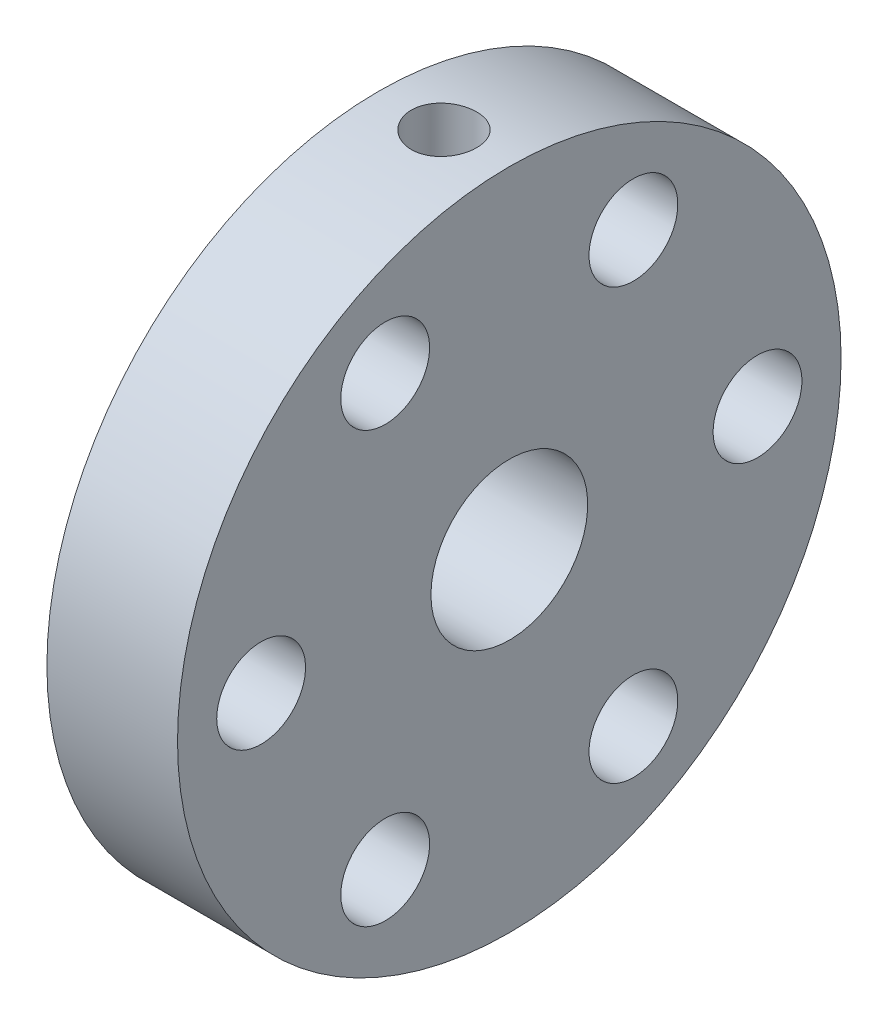
ISO-10303-21;
HEADER;
FILE_DESCRIPTION(('STEP AP214'),'2;1');
FILE_NAME('part.step','',(''),(''),'','','');
FILE_SCHEMA(('AUTOMOTIVE_DESIGN { 1 0 10303 214 1 1 1 1 }'));
ENDSEC;
DATA;
#1=APPLICATION_CONTEXT('core data for automotive mechanical design processes');
#2=APPLICATION_PROTOCOL_DEFINITION('international standard','automotive_design',2000,#1);
#3=PRODUCT_CONTEXT('',#1,'mechanical');
#4=PRODUCT('Part','Part','',(#3));
#5=PRODUCT_RELATED_PRODUCT_CATEGORY('part','',(#4));
#6=PRODUCT_DEFINITION_FORMATION('','',#4);
#7=PRODUCT_DEFINITION_CONTEXT('part definition',#1,'design');
#8=PRODUCT_DEFINITION('design','',#6,#7);
#9=PRODUCT_DEFINITION_SHAPE('','',#8);
#10=(LENGTH_UNIT() NAMED_UNIT(*) SI_UNIT(.MILLI.,.METRE.));
#11=(NAMED_UNIT(*) PLANE_ANGLE_UNIT() SI_UNIT($,.RADIAN.));
#12=(NAMED_UNIT(*) SI_UNIT($,.STERADIAN.) SOLID_ANGLE_UNIT());
#13=UNCERTAINTY_MEASURE_WITH_UNIT(LENGTH_MEASURE(1.E-05),#10,'distance_accuracy_value','');
#14=(GEOMETRIC_REPRESENTATION_CONTEXT(3) GLOBAL_UNCERTAINTY_ASSIGNED_CONTEXT((#13)) GLOBAL_UNIT_ASSIGNED_CONTEXT((#10,
#11,#12)) REPRESENTATION_CONTEXT('',''));
#15=CARTESIAN_POINT('',(0.,0.,0.));
#16=DIRECTION('',(0.,0.,1.));
#17=DIRECTION('',(1.,0.,0.));
#18=AXIS2_PLACEMENT_3D('',#15,#16,#17);
#19=CARTESIAN_POINT('',(-4.2,0.,0.));
#20=DIRECTION('',(-1.,0.,0.));
#21=DIRECTION('',(0.,0.,1.));
#22=AXIS2_PLACEMENT_3D('',#19,#20,#21);
#23=PLANE('',#22);
#24=CARTESIAN_POINT('',(-4.2,0.,0.));
#25=DIRECTION('',(-1.,0.,0.));
#26=DIRECTION('',(0.,0.,1.));
#27=AXIS2_PLACEMENT_3D('',#24,#25,#26);
#28=CIRCLE('',#27,6.);
#29=CARTESIAN_POINT('',(-4.2,0.,6.));
#30=VERTEX_POINT('',#29);
#31=EDGE_CURVE('E115',#30,#30,#28,.T.);
#32=ORIENTED_EDGE('',*,*,#31,.T.);
#33=EDGE_LOOP('',(#32));
#34=FACE_BOUND('',#33,.T.);
#35=CARTESIAN_POINT('',(-4.2,0.,0.));
#36=DIRECTION('',(-1.,0.,0.));
#37=DIRECTION('',(0.,0.,1.));
#38=AXIS2_PLACEMENT_3D('',#35,#36,#37);
#39=CIRCLE('',#38,3.);
#40=CARTESIAN_POINT('',(-4.2,0.,3.));
#41=VERTEX_POINT('',#40);
#42=EDGE_CURVE('E41',#41,#41,#39,.T.);
#43=ORIENTED_EDGE('',*,*,#42,.F.);
#44=EDGE_LOOP('',(#43));
#45=FACE_BOUND('',#44,.T.);
#46=ADVANCED_FACE('F31',(#34,#45),#23,.T.);
#47=CARTESIAN_POINT('',(0.,0.,0.));
#48=DIRECTION('',(-1.,0.,0.));
#49=DIRECTION('',(0.,0.,1.));
#50=AXIS2_PLACEMENT_3D('',#47,#48,#49);
#51=CYLINDRICAL_SURFACE('',#50,3.);
#52=CARTESIAN_POINT('',(2.5,2.72717802865893,-1.25));
#53=CARTESIAN_POINT('',(2.56667189089685,2.72718519563219,-1.24999259066567));
#54=CARTESIAN_POINT('',(2.63345265682622,2.729658595344,-1.24463203881503));
#55=CARTESIAN_POINT('',(2.76508694205714,2.73923833650884,-1.22339678947784));
#56=CARTESIAN_POINT('',(2.82993472667524,2.74635725824267,-1.20749354003276));
#57=CARTESIAN_POINT('',(2.95556112969107,2.76426917574768,-1.1658998841945));
#58=CARTESIAN_POINT('',(3.01635516371502,2.77504717562616,-1.14024937431428));
#59=CARTESIAN_POINT('',(3.13275944957805,2.79904148565793,-1.08000637754462));
#60=CARTESIAN_POINT('',(3.18837092343312,2.81225721880783,-1.04541600591531));
#61=CARTESIAN_POINT('',(3.29632572497347,2.84055762619857,-0.965973882676165));
#62=CARTESIAN_POINT('',(3.34830755874409,2.85570568079146,-0.920653238184407));
#63=CARTESIAN_POINT('',(3.44420022249755,2.88564295372227,-0.822021675745548));
#64=CARTESIAN_POINT('',(3.48810794061301,2.90043203180789,-0.768707691374003));
#65=CARTESIAN_POINT('',(3.56844953087928,2.92875537930613,-0.652763393797347));
#66=CARTESIAN_POINT('',(3.60447662803235,2.94220739975291,-0.589829293683658));
#67=CARTESIAN_POINT('',(3.6652760205056,2.96556519993426,-0.458132022362352));
#68=CARTESIAN_POINT('',(3.69005331196422,2.97547255347157,-0.389371454872124));
#69=CARTESIAN_POINT('',(3.72633945875674,2.99017521042367,-0.251768498025165));
#70=CARTESIAN_POINT('',(3.73847169490204,2.99520971127466,-0.18311657619608));
#71=CARTESIAN_POINT('',(3.75113764115986,3.00046828611204,-0.044579180365006));
#72=CARTESIAN_POINT('',(3.75167605588296,3.00069431131015,0.0253057817645163));
#73=CARTESIAN_POINT('',(3.74146571906668,2.99645129133057,0.159792780112568));
#74=CARTESIAN_POINT('',(3.73140189947427,2.99226714648664,0.224457488607313));
#75=CARTESIAN_POINT('',(3.70144689736184,2.98006516750309,0.351082893931455));
#76=CARTESIAN_POINT('',(3.68155499036983,2.97204705074577,0.413043391054915));
#77=CARTESIAN_POINT('',(3.63227195910536,2.95279852414029,0.533638118077525));
#78=CARTESIAN_POINT('',(3.60274053712917,2.94152097126085,0.592207177074905));
#79=CARTESIAN_POINT('',(3.53515424329966,2.91685713989805,0.703711767281962));
#80=CARTESIAN_POINT('',(3.49709635915501,2.90347011666255,0.756645297756973));
#81=CARTESIAN_POINT('',(3.41041757959538,2.87481698777061,0.859340911707923));
#82=CARTESIAN_POINT('',(3.36124120872099,2.8594849435601,0.908616437316239));
#83=CARTESIAN_POINT('',(3.25528855929342,2.8293786068147,0.998431414927666));
#84=CARTESIAN_POINT('',(3.19850936170791,2.8146045313137,1.03896749582431));
#85=CARTESIAN_POINT('',(3.07660496333809,2.78681612355338,1.11140189250063));
#86=CARTESIAN_POINT('',(3.01126679425672,2.77387558556714,1.1429725335554));
#87=CARTESIAN_POINT('',(2.8755189550255,2.75209844221011,1.19446432058391));
#88=CARTESIAN_POINT('',(2.80511295173045,2.74325890334594,1.21439379627313));
#89=CARTESIAN_POINT('',(2.666103191086,2.73141212519724,1.24080025168121));
#90=CARTESIAN_POINT('',(2.59767887774095,2.72806369197117,1.24806614632866));
#91=CARTESIAN_POINT('',(2.4605215175885,2.72660286810642,1.25125630518998));
#92=CARTESIAN_POINT('',(2.39178858580829,2.72848866599319,1.24718449318149));
#93=CARTESIAN_POINT('',(2.26060161456955,2.73693131345749,1.22853477565556));
#94=CARTESIAN_POINT('',(2.1980273132132,2.74318138016618,1.21464618818048));
#95=CARTESIAN_POINT('',(2.07614870350213,2.75925630297447,1.17767058564225));
#96=CARTESIAN_POINT('',(2.01684516316929,2.76908199460161,1.15458142053125));
#97=CARTESIAN_POINT('',(1.90038468964353,2.79170797857,1.09877520805186));
#98=CARTESIAN_POINT('',(1.84342502538968,2.80461662202282,1.06569183306198));
#99=CARTESIAN_POINT('',(1.73559194750098,2.83180003740794,0.991200784385969));
#100=CARTESIAN_POINT('',(1.68472118329813,2.84607539920583,0.949789507875986));
#101=CARTESIAN_POINT('',(1.586199865116,2.87578619784532,0.855844455715504));
#102=CARTESIAN_POINT('',(1.53914860004934,2.89122146708842,0.802679661479737));
#103=CARTESIAN_POINT('',(1.45452770802067,2.92043361183923,0.688851512553538));
#104=CARTESIAN_POINT('',(1.4169587759363,2.93421036577013,0.628187608803656));
#105=CARTESIAN_POINT('',(1.35241012455643,2.9586425158565,0.500654680803384));
#106=CARTESIAN_POINT('',(1.32545775871052,2.96928983138826,0.433770169638506));
#107=CARTESIAN_POINT('',(1.28338320766557,2.98618173103366,0.295858835154416));
#108=CARTESIAN_POINT('',(1.26825398177393,2.9924289351992,0.224834504225195));
#109=CARTESIAN_POINT('',(1.25114187447969,2.9995153479751,0.0860165335064112));
#110=CARTESIAN_POINT('',(1.24831400030304,3.00070204534225,0.018344084793898));
#111=CARTESIAN_POINT('',(1.25361314129394,2.99849523480953,-0.116486811714285));
#112=CARTESIAN_POINT('',(1.26173823601287,2.99510252984313,-0.183645347541155));
#113=CARTESIAN_POINT('',(1.28810607215866,2.98430065981734,-0.313086482449184));
#114=CARTESIAN_POINT('',(1.30597968046955,2.97703824209233,-0.375457537843568));
#115=CARTESIAN_POINT('',(1.35093424720913,2.95929499847058,-0.49629223050133));
#116=CARTESIAN_POINT('',(1.37801695466491,2.94881356124207,-0.554755122985826));
#117=CARTESIAN_POINT('',(1.44198952921447,2.92505825398662,-0.669024565478781));
#118=CARTESIAN_POINT('',(1.47926730142399,2.91167959188766,-0.724591657976681));
#119=CARTESIAN_POINT('',(1.56200718287189,2.88371561874231,-0.828918675638781));
#120=CARTESIAN_POINT('',(1.60747233040675,2.86912986083797,-0.877676061786041));
#121=CARTESIAN_POINT('',(1.70894482585441,2.83914845259141,-0.970449787231579));
#122=CARTESIAN_POINT('',(1.76545901462112,2.82376522857896,-1.01391775364847));
#123=CARTESIAN_POINT('',(1.8854587406802,2.79495552690186,-1.09083332306674));
#124=CARTESIAN_POINT('',(1.94894814805814,2.78153014522558,-1.12427532456755));
#125=CARTESIAN_POINT('',(2.08094383502275,2.75842557732642,-1.17982766043577));
#126=CARTESIAN_POINT('',(2.14942115879321,2.74872654469865,-1.20199823632853));
#127=CARTESIAN_POINT('',(2.28953957385067,2.73440803066667,-1.23423556453801));
#128=CARTESIAN_POINT('',(2.3611692072743,2.72977151604981,-1.2443429152121));
#129=CARTESIAN_POINT('',(2.45535852426189,2.72744979732688,-1.24940464923649));
#130=CARTESIAN_POINT('',(2.47767315738804,2.72717562860874,-1.25000248121118));
#131=CARTESIAN_POINT('',(2.5,2.72717802865893,-1.25));
#132=B_SPLINE_CURVE_WITH_KNOTS('',3,(#52,#53,#54,#55,#56,#57,#58,#59,#60,#61,#62,#63,#64,#65,
#66,#67,#68,#69,#70,#71,#72,#73,#74,#75,#76,#77,#78,#79,#80,#81,#82,#83,#84,#85,#86,#87,#88,#89,
#90,#91,#92,#93,#94,#95,#96,#97,#98,#99,#100,#101,#102,#103,#104,#105,#106,#107,#108,#109,#110,
#111,#112,#113,#114,#115,#116,#117,#118,#119,#120,#121,#122,#123,#124,#125,#126,#127,#128,#129,
#130,#131),.UNSPECIFIED.,.T.,.F.,(4,2,2,2,2,2,2,2,2,2,2,2,2,2,2,2,2,2,2,2,2,2,2,2,2,2,2,2,2,2,2,
2,2,2,2,2,2,2,2,4),(0.,0.199951711985515,0.400447161842175,0.60013065215211,0.799766938550098,
1.01066841430654,1.2216510045991,1.44178476577924,1.66182066774891,1.87040605977952,
2.0789068091793,2.27471840245092,2.47054443201883,2.66935814640065,2.86824221022483,
3.08114531844484,3.29413040441366,3.51411545666721,3.73394290745568,3.93950778306307,
4.14500152518448,4.33733901066191,4.52972146913529,4.73025126818168,4.93086800795465,
5.14781662735513,5.36478114041865,5.58230105955594,5.79969134643007,6.00188635094053,
6.20404590801913,6.39903415036487,6.59405944632172,6.79789862829036,7.00181361048903,
7.21960426908076,7.43751638139188,7.65425125796864,7.87025464546161,7.93721375436705),.UNSPECIFIED.);
#133=CARTESIAN_POINT('',(2.5,2.72717802865893,-1.25));
#134=VERTEX_POINT('',#133);
#135=EDGE_CURVE('E59',#134,#134,#132,.T.);
#136=ORIENTED_EDGE('',*,*,#135,.F.);
#137=EDGE_LOOP('',(#136));
#138=FACE_BOUND('',#137,.T.);
#139=CARTESIAN_POINT('',(-2.1,2.72717802865893,-1.25));
#140=CARTESIAN_POINT('',(-2.03332810910315,2.72718519563219,-1.24999259066567));
#141=CARTESIAN_POINT('',(-1.96654734317379,2.729658595344,-1.24463203881503));
#142=CARTESIAN_POINT('',(-1.83491305794286,2.73923833650884,-1.22339678947784));
#143=CARTESIAN_POINT('',(-1.77006527332477,2.74635725824267,-1.20749354003276));
#144=CARTESIAN_POINT('',(-1.64443887030893,2.76426917574768,-1.1658998841945));
#145=CARTESIAN_POINT('',(-1.58364483628498,2.77504717562616,-1.14024937431428));
#146=CARTESIAN_POINT('',(-1.46724055042195,2.79904148565793,-1.08000637754462));
#147=CARTESIAN_POINT('',(-1.41162907656688,2.81225721880783,-1.04541600591531));
#148=CARTESIAN_POINT('',(-1.30367427502653,2.84055762619857,-0.965973882676165));
#149=CARTESIAN_POINT('',(-1.25169244125591,2.85570568079146,-0.920653238184407));
#150=CARTESIAN_POINT('',(-1.15579977750245,2.88564295372227,-0.822021675745549));
#151=CARTESIAN_POINT('',(-1.11189205938699,2.90043203180789,-0.768707691374003));
#152=CARTESIAN_POINT('',(-1.03155046912072,2.92875537930613,-0.652763393797347));
#153=CARTESIAN_POINT('',(-0.995523371967654,2.94220739975291,-0.589829293683658));
#154=CARTESIAN_POINT('',(-0.934723979494398,2.96556519993426,-0.458132022362352));
#155=CARTESIAN_POINT('',(-0.909946688035785,2.97547255347157,-0.389371454872124));
#156=CARTESIAN_POINT('',(-0.873660541243262,2.99017521042367,-0.251768498025165));
#157=CARTESIAN_POINT('',(-0.861528305097957,2.99520971127466,-0.18311657619608));
#158=CARTESIAN_POINT('',(-0.848862358840145,3.00046828611204,-0.0445791803650059));
#159=CARTESIAN_POINT('',(-0.848323944117042,3.00069431131015,0.0253057817645164));
#160=CARTESIAN_POINT('',(-0.858534280933322,2.99645129133057,0.159792780112568));
#161=CARTESIAN_POINT('',(-0.86859810052573,2.99226714648664,0.224457488607313));
#162=CARTESIAN_POINT('',(-0.898553102638165,2.98006516750309,0.351082893931455));
#163=CARTESIAN_POINT('',(-0.918445009630167,2.97204705074577,0.413043391054915));
#164=CARTESIAN_POINT('',(-0.967728040894644,2.95279852414029,0.533638118077525));
#165=CARTESIAN_POINT('',(-0.997259462870826,2.94152097126085,0.592207177074905));
#166=CARTESIAN_POINT('',(-1.06484575670034,2.91685713989805,0.703711767281962));
#167=CARTESIAN_POINT('',(-1.10290364084499,2.90347011666255,0.756645297756973));
#168=CARTESIAN_POINT('',(-1.18958242040462,2.87481698777061,0.859340911707922));
#169=CARTESIAN_POINT('',(-1.23875879127901,2.8594849435601,0.908616437316239));
#170=CARTESIAN_POINT('',(-1.34471144070658,2.8293786068147,0.998431414927666));
#171=CARTESIAN_POINT('',(-1.40149063829209,2.8146045313137,1.03896749582431));
#172=CARTESIAN_POINT('',(-1.52339503666191,2.78681612355338,1.11140189250063));
#173=CARTESIAN_POINT('',(-1.58873320574328,2.77387558556714,1.1429725335554));
#174=CARTESIAN_POINT('',(-1.7244810449745,2.75209844221011,1.19446432058391));
#175=CARTESIAN_POINT('',(-1.79488704826955,2.74325890334594,1.21439379627313));
#176=CARTESIAN_POINT('',(-1.933896808914,2.73141212519724,1.24080025168121));
#177=CARTESIAN_POINT('',(-2.00232112225905,2.72806369197117,1.24806614632866));
#178=CARTESIAN_POINT('',(-2.1394784824115,2.72660286810642,1.25125630518998));
#179=CARTESIAN_POINT('',(-2.20821141419171,2.72848866599319,1.24718449318149));
#180=CARTESIAN_POINT('',(-2.33939838543045,2.73693131345749,1.22853477565556));
#181=CARTESIAN_POINT('',(-2.4019726867868,2.74318138016618,1.21464618818048));
#182=CARTESIAN_POINT('',(-2.52385129649787,2.75925630297447,1.17767058564225));
#183=CARTESIAN_POINT('',(-2.58315483683071,2.76908199460161,1.15458142053125));
#184=CARTESIAN_POINT('',(-2.69961531035647,2.79170797857,1.09877520805186));
#185=CARTESIAN_POINT('',(-2.75657497461032,2.80461662202282,1.06569183306198));
#186=CARTESIAN_POINT('',(-2.86440805249902,2.83180003740794,0.991200784385969));
#187=CARTESIAN_POINT('',(-2.91527881670187,2.84607539920583,0.949789507875986));
#188=CARTESIAN_POINT('',(-3.013800134884,2.87578619784532,0.855844455715504));
#189=CARTESIAN_POINT('',(-3.06085139995066,2.89122146708842,0.802679661479737));
#190=CARTESIAN_POINT('',(-3.14547229197933,2.92043361183923,0.688851512553538));
#191=CARTESIAN_POINT('',(-3.1830412240637,2.93421036577013,0.628187608803656));
#192=CARTESIAN_POINT('',(-3.24758987544357,2.9586425158565,0.500654680803384));
#193=CARTESIAN_POINT('',(-3.27454224128948,2.96928983138826,0.433770169638506));
#194=CARTESIAN_POINT('',(-3.31661679233443,2.98618173103366,0.295858835154417));
#195=CARTESIAN_POINT('',(-3.33174601822607,2.9924289351992,0.224834504225195));
#196=CARTESIAN_POINT('',(-3.34885812552031,2.9995153479751,0.0860165335064115));
#197=CARTESIAN_POINT('',(-3.35168599969696,3.00070204534225,0.0183440847938983));
#198=CARTESIAN_POINT('',(-3.34638685870606,2.99849523480953,-0.116486811714285));
#199=CARTESIAN_POINT('',(-3.33826176398713,2.99510252984313,-0.183645347541154));
#200=CARTESIAN_POINT('',(-3.31189392784134,2.98430065981734,-0.313086482449184));
#201=CARTESIAN_POINT('',(-3.29402031953045,2.97703824209233,-0.375457537843568));
#202=CARTESIAN_POINT('',(-3.24906575279087,2.95929499847058,-0.496292230501329));
#203=CARTESIAN_POINT('',(-3.22198304533509,2.94881356124207,-0.554755122985826));
#204=CARTESIAN_POINT('',(-3.15801047078553,2.92505825398662,-0.669024565478781));
#205=CARTESIAN_POINT('',(-3.12073269857601,2.91167959188766,-0.724591657976681));
#206=CARTESIAN_POINT('',(-3.03799281712811,2.88371561874231,-0.828918675638781));
#207=CARTESIAN_POINT('',(-2.99252766959325,2.86912986083797,-0.877676061786041));
#208=CARTESIAN_POINT('',(-2.8910551741456,2.83914845259141,-0.970449787231579));
#209=CARTESIAN_POINT('',(-2.83454098537888,2.82376522857896,-1.01391775364847));
#210=CARTESIAN_POINT('',(-2.71454125931981,2.79495552690186,-1.09083332306674));
#211=CARTESIAN_POINT('',(-2.65105185194186,2.78153014522558,-1.12427532456755));
#212=CARTESIAN_POINT('',(-2.51905616497725,2.75842557732642,-1.17982766043577));
#213=CARTESIAN_POINT('',(-2.45057884120679,2.74872654469865,-1.20199823632853));
#214=CARTESIAN_POINT('',(-2.31046042614933,2.73440803066667,-1.23423556453801));
#215=CARTESIAN_POINT('',(-2.2388307927257,2.72977151604981,-1.2443429152121));
#216=CARTESIAN_POINT('',(-2.14464147573811,2.72744979732688,-1.24940464923649));
#217=CARTESIAN_POINT('',(-2.12232684261197,2.72717562860874,-1.25000248121118));
#218=CARTESIAN_POINT('',(-2.1,2.72717802865893,-1.25));
#219=B_SPLINE_CURVE_WITH_KNOTS('',3,(#139,#140,#141,#142,#143,#144,#145,#146,#147,#148,#149,
#150,#151,#152,#153,#154,#155,#156,#157,#158,#159,#160,#161,#162,#163,#164,#165,#166,#167,#168,
#169,#170,#171,#172,#173,#174,#175,#176,#177,#178,#179,#180,#181,#182,#183,#184,#185,#186,#187,
#188,#189,#190,#191,#192,#193,#194,#195,#196,#197,#198,#199,#200,#201,#202,#203,#204,#205,#206,
#207,#208,#209,#210,#211,#212,#213,#214,#215,#216,#217,#218),.UNSPECIFIED.,.T.,.F.,(4,2,2,2,2,2,
2,2,2,2,2,2,2,2,2,2,2,2,2,2,2,2,2,2,2,2,2,2,2,2,2,2,2,2,2,2,2,2,2,4),(0.,0.199951711985514,
0.400447161842175,0.600130652152111,0.799766938550099,1.01066841430654,1.2216510045991,
1.44178476577924,1.66182066774891,1.87040605977952,2.0789068091793,2.27471840245092,
2.47054443201883,2.66935814640065,2.86824221022483,3.08114531844484,3.29413040441366,
3.51411545666721,3.73394290745568,3.93950778306307,4.14500152518448,4.33733901066191,
4.52972146913529,4.73025126818168,4.93086800795465,5.14781662735513,5.36478114041865,
5.58230105955594,5.79969134643006,6.00188635094052,6.20404590801913,6.39903415036487,
6.59405944632172,6.79789862829036,7.00181361048903,7.21960426908076,7.43751638139188,
7.65425125796864,7.87025464546161,7.93721375436705),.UNSPECIFIED.);
#220=CARTESIAN_POINT('',(-2.1,2.72717802865893,-1.25));
#221=VERTEX_POINT('',#220);
#222=EDGE_CURVE('E53',#221,#221,#219,.T.);
#223=ORIENTED_EDGE('',*,*,#222,.F.);
#224=EDGE_LOOP('',(#223));
#225=FACE_BOUND('',#224,.T.);
#226=ORIENTED_EDGE('',*,*,#42,.T.);
#227=EDGE_LOOP('',(#226));
#228=FACE_BOUND('',#227,.T.);
#229=CARTESIAN_POINT('',(5.,0.,0.));
#230=DIRECTION('',(-1.,0.,0.));
#231=DIRECTION('',(0.,0.,1.));
#232=AXIS2_PLACEMENT_3D('',#229,#230,#231);
#233=CIRCLE('',#232,3.);
#234=CARTESIAN_POINT('',(5.,0.,3.));
#235=VERTEX_POINT('',#234);
#236=EDGE_CURVE('E45',#235,#235,#233,.T.);
#237=ORIENTED_EDGE('',*,*,#236,.F.);
#238=EDGE_LOOP('',(#237));
#239=FACE_BOUND('',#238,.T.);
#240=ADVANCED_FACE('F60',(#138,#225,#228,#239),#51,.F.);
#241=CARTESIAN_POINT('',(5.,0.,0.));
#242=DIRECTION('',(-1.,0.,0.));
#243=DIRECTION('',(0.,0.,1.));
#244=AXIS2_PLACEMENT_3D('',#241,#242,#243);
#245=PLANE('',#244);
#246=CARTESIAN_POINT('',(5.,8.22724133595217,4.75));
#247=DIRECTION('',(-1.,0.,0.));
#248=DIRECTION('',(0.,0.,1.));
#249=AXIS2_PLACEMENT_3D('',#246,#247,#248);
#250=CIRCLE('',#249,1.7);
#251=CARTESIAN_POINT('',(5.,8.22724133595217,6.45));
#252=VERTEX_POINT('',#251);
#253=EDGE_CURVE('E167',#252,#252,#250,.T.);
#254=ORIENTED_EDGE('',*,*,#253,.T.);
#255=EDGE_LOOP('',(#254));
#256=FACE_BOUND('',#255,.T.);
#257=CARTESIAN_POINT('',(5.,8.22724133595217,-4.75));
#258=DIRECTION('',(-1.,0.,0.));
#259=DIRECTION('',(0.,0.,1.));
#260=AXIS2_PLACEMENT_3D('',#257,#258,#259);
#261=CIRCLE('',#260,1.7);
#262=CARTESIAN_POINT('',(5.,8.22724133595217,-3.05));
#263=VERTEX_POINT('',#262);
#264=EDGE_CURVE('E162',#263,#263,#261,.T.);
#265=ORIENTED_EDGE('',*,*,#264,.T.);
#266=EDGE_LOOP('',(#265));
#267=FACE_BOUND('',#266,.T.);
#268=CARTESIAN_POINT('',(5.,0.,-9.5));
#269=DIRECTION('',(-1.,0.,0.));
#270=DIRECTION('',(0.,0.,1.));
#271=AXIS2_PLACEMENT_3D('',#268,#269,#270);
#272=CIRCLE('',#271,1.7);
#273=CARTESIAN_POINT('',(5.,0.,-7.8));
#274=VERTEX_POINT('',#273);
#275=EDGE_CURVE('E156',#274,#274,#272,.T.);
#276=ORIENTED_EDGE('',*,*,#275,.T.);
#277=EDGE_LOOP('',(#276));
#278=FACE_BOUND('',#277,.T.);
#279=CARTESIAN_POINT('',(5.,-8.22724133595217,-4.75));
#280=DIRECTION('',(-1.,0.,0.));
#281=DIRECTION('',(0.,0.,1.));
#282=AXIS2_PLACEMENT_3D('',#279,#280,#281);
#283=CIRCLE('',#282,1.7);
#284=CARTESIAN_POINT('',(5.,-8.22724133595217,-3.05));
#285=VERTEX_POINT('',#284);
#286=EDGE_CURVE('E150',#285,#285,#283,.T.);
#287=ORIENTED_EDGE('',*,*,#286,.T.);
#288=EDGE_LOOP('',(#287));
#289=FACE_BOUND('',#288,.T.);
#290=CARTESIAN_POINT('',(5.,-8.22724133595217,4.75));
#291=DIRECTION('',(-1.,0.,0.));
#292=DIRECTION('',(0.,0.,1.));
#293=AXIS2_PLACEMENT_3D('',#290,#291,#292);
#294=CIRCLE('',#293,1.7);
#295=CARTESIAN_POINT('',(5.,-8.22724133595217,6.45));
#296=VERTEX_POINT('',#295);
#297=EDGE_CURVE('E144',#296,#296,#294,.T.);
#298=ORIENTED_EDGE('',*,*,#297,.T.);
#299=EDGE_LOOP('',(#298));
#300=FACE_BOUND('',#299,.T.);
#301=CARTESIAN_POINT('',(5.,0.,9.5));
#302=DIRECTION('',(-1.,0.,0.));
#303=DIRECTION('',(0.,0.,1.));
#304=AXIS2_PLACEMENT_3D('',#301,#302,#303);
#305=CIRCLE('',#304,1.7);
#306=CARTESIAN_POINT('',(5.,0.,11.2));
#307=VERTEX_POINT('',#306);
#308=EDGE_CURVE('E118',#307,#307,#305,.T.);
#309=ORIENTED_EDGE('',*,*,#308,.T.);
#310=EDGE_LOOP('',(#309));
#311=FACE_BOUND('',#310,.T.);
#312=CARTESIAN_POINT('',(5.,0.,0.));
#313=DIRECTION('',(-1.,0.,0.));
#314=DIRECTION('',(0.,0.,1.));
#315=AXIS2_PLACEMENT_3D('',#312,#313,#314);
#316=CIRCLE('',#315,12.7);
#317=CARTESIAN_POINT('',(5.,0.,12.7));
#318=VERTEX_POINT('',#317);
#319=EDGE_CURVE('E50',#318,#318,#316,.T.);
#320=ORIENTED_EDGE('',*,*,#319,.F.);
#321=EDGE_LOOP('',(#320));
#322=FACE_BOUND('',#321,.T.);
#323=ORIENTED_EDGE('',*,*,#236,.T.);
#324=EDGE_LOOP('',(#323));
#325=FACE_BOUND('',#324,.T.);
#326=ADVANCED_FACE('F98',(#256,#267,#278,#289,#300,#311,#322,#325),#245,.F.);
#327=CARTESIAN_POINT('',(0.,0.,0.));
#328=DIRECTION('',(-1.,0.,0.));
#329=DIRECTION('',(0.,0.,1.));
#330=AXIS2_PLACEMENT_3D('',#327,#328,#329);
#331=CYLINDRICAL_SURFACE('',#330,12.7);
#332=CARTESIAN_POINT('',(1.25,12.7,0.));
#333=CARTESIAN_POINT('',(1.25000303546489,12.6999992053767,0.0700312826447145));
#334=CARTESIAN_POINT('',(1.25590506924033,12.6994145852931,0.140109006787541));
#335=CARTESIAN_POINT('',(1.27936056646902,12.6971386355552,0.278322027844061));
#336=CARTESIAN_POINT('',(1.29692690368872,12.6954460831171,0.346455091701957));
#337=CARTESIAN_POINT('',(1.3431950211263,12.6911453487048,0.478757289636588));
#338=CARTESIAN_POINT('',(1.37189011935505,12.6885377162568,0.542928775594425));
#339=CARTESIAN_POINT('',(1.43958834239712,12.6826984877893,0.665530357530225));
#340=CARTESIAN_POINT('',(1.47858940161936,12.6794670168387,0.723961600791192));
#341=CARTESIAN_POINT('',(1.56593867561093,12.6727295439492,0.833642201405574));
#342=CARTESIAN_POINT('',(1.61431552194277,12.6692227211751,0.884868708381635));
#343=CARTESIAN_POINT('',(1.71898211143332,12.6623365830734,0.978489341246066));
#344=CARTESIAN_POINT('',(1.77527221846294,12.6589572736182,1.02088306075885));
#345=CARTESIAN_POINT('',(1.89431002660821,12.6527003451726,1.09571529914481));
#346=CARTESIAN_POINT('',(1.95707074991373,12.6498237705616,1.12813319805397));
#347=CARTESIAN_POINT('',(2.087177901841,12.6449081047838,1.18196189962952));
#348=CARTESIAN_POINT('',(2.15452422044288,12.6428689935324,1.20337296627197));
#349=CARTESIAN_POINT('',(2.2916581946059,12.6398664963312,1.23451262073334));
#350=CARTESIAN_POINT('',(2.36143718133028,12.6388996272722,1.24427904323655));
#351=CARTESIAN_POINT('',(2.50165010379155,12.6381402528445,1.25196912321573));
#352=CARTESIAN_POINT('',(2.57208402277234,12.6383477175131,1.24989308284717));
#353=CARTESIAN_POINT('',(2.71134679843134,12.6399103906683,1.23398836132346));
#354=CARTESIAN_POINT('',(2.7801804223952,12.6412615667039,1.22020097097042));
#355=CARTESIAN_POINT('',(2.91455192058459,12.6449531171045,1.18132916034646));
#356=CARTESIAN_POINT('',(2.98008975152932,12.647293504456,1.15624459176254));
#357=CARTESIAN_POINT('',(3.1061398371098,12.6527044143333,1.09544483971353));
#358=CARTESIAN_POINT('',(3.16664318915494,12.6557761946647,1.05971131587941));
#359=CARTESIAN_POINT('',(3.28080943580754,12.6623027037322,0.978641180257098));
#360=CARTESIAN_POINT('',(3.33447213642915,12.6657574433229,0.933304296235703));
#361=CARTESIAN_POINT('',(3.43367374710584,12.6726785733742,0.834083669760972));
#362=CARTESIAN_POINT('',(3.47917699540742,12.6761449506051,0.780164263845078));
#363=CARTESIAN_POINT('',(3.5604916939966,12.6826848403127,0.665433065104139));
#364=CARTESIAN_POINT('',(3.59630313392646,12.6857583523697,0.604621264913219));
#365=CARTESIAN_POINT('',(3.6572161493743,12.6911671737587,0.477806949734055));
#366=CARTESIAN_POINT('',(3.68231593898526,12.6935023599762,0.411803571347312));
#367=CARTESIAN_POINT('',(3.72106714583988,12.6971701449661,0.276491240194607));
#368=CARTESIAN_POINT('',(3.73471889471556,12.6985027727811,0.207182383244721));
#369=CARTESIAN_POINT('',(3.75014130971684,12.7000115586395,0.0675353800145727));
#370=CARTESIAN_POINT('',(3.75196119131861,12.7001925071073,-0.00279728138426526));
#371=CARTESIAN_POINT('',(3.74379744092128,12.6993903861296,-0.142766620743804));
#372=CARTESIAN_POINT('',(3.73381396331996,12.6984073319102,-0.212403307796412));
#373=CARTESIAN_POINT('',(3.70236771450182,12.6953907525744,-0.348862094124246));
#374=CARTESIAN_POINT('',(3.68092796338468,12.6933593343073,-0.415689548778698));
#375=CARTESIAN_POINT('',(3.62720140592747,12.6884739561919,-0.54479929266125));
#376=CARTESIAN_POINT('',(3.59491436360548,12.6856199784491,-0.607081482971618));
#377=CARTESIAN_POINT('',(3.52028751417399,12.6793968558126,-0.725555402313412));
#378=CARTESIAN_POINT('',(3.47791534442075,12.6760260651466,-0.781726658247031));
#379=CARTESIAN_POINT('',(3.38436746867763,12.6691529099366,-0.886177033231955));
#380=CARTESIAN_POINT('',(3.33319154874042,12.6656505421968,-0.934455960429517));
#381=CARTESIAN_POINT('',(3.22327424693379,12.6588945826013,-1.02192188780566));
#382=CARTESIAN_POINT('',(3.16450711355365,12.6556419005479,-1.06107660655671));
#383=CARTESIAN_POINT('',(3.04120270259734,12.6497673268535,-1.12896079934358));
#384=CARTESIAN_POINT('',(2.97666550180381,12.6471454268203,-1.15769041208121));
#385=CARTESIAN_POINT('',(2.84376400563289,12.6428348924729,-1.20385472580367));
#386=CARTESIAN_POINT('',(2.7754064554804,12.6411446671599,-1.22130869076844));
#387=CARTESIAN_POINT('',(2.63671346216954,12.6388838699205,-1.24448878134745));
#388=CARTESIAN_POINT('',(2.56637807386188,12.638313266975,-1.25021523187232));
#389=CARTESIAN_POINT('',(2.42604681895445,12.6383569507631,-1.2497733093753));
#390=CARTESIAN_POINT('',(2.35605078555568,12.6389661859801,-1.24365564734899));
#391=CARTESIAN_POINT('',(2.21808591692656,12.6412901330464,-1.21980542436043));
#392=CARTESIAN_POINT('',(2.15011708406989,12.6430048461901,-1.20207284979864));
#393=CARTESIAN_POINT('',(2.01813601419488,12.6473451495994,-1.15551004195296));
#394=CARTESIAN_POINT('',(1.95412326821993,12.6499706224057,-1.12668123967943));
#395=CARTESIAN_POINT('',(1.83183715655239,12.6558368552843,-1.05874958964909));
#396=CARTESIAN_POINT('',(1.77356375284335,12.6590776112807,-1.01964680995168));
#397=CARTESIAN_POINT('',(1.66415061890366,12.6658258690576,-0.932086701457347));
#398=CARTESIAN_POINT('',(1.61304117952309,12.669334412013,-0.883591601308591));
#399=CARTESIAN_POINT('',(1.5196628547399,12.6762134065084,-0.778697716558494));
#400=CARTESIAN_POINT('',(1.47739609199076,12.6795838247362,-0.722297039664842));
#401=CARTESIAN_POINT('',(1.40282209313431,12.6858153424876,-0.603042575710227));
#402=CARTESIAN_POINT('',(1.37053950839736,12.6886751741136,-0.540173319004094));
#403=CARTESIAN_POINT('',(1.3170320885035,12.6935494159781,-0.409918728568404));
#404=CARTESIAN_POINT('',(1.29579476079757,12.6955647808325,-0.342538594616497));
#405=CARTESIAN_POINT('',(1.27028784430099,12.6980154922455,-0.228979465526958));
#406=CARTESIAN_POINT('',(1.26269026869299,12.6987562208227,-0.183526855955051));
#407=CARTESIAN_POINT('',(1.25254535880599,12.6997487349209,-0.0920561862478512));
#408=CARTESIAN_POINT('',(1.24999800450432,12.7000005223804,-0.0460381283551265));
#409=CARTESIAN_POINT('',(1.25,12.7,0.));
#410=B_SPLINE_CURVE_WITH_KNOTS('',3,(#332,#333,#334,#335,#336,#337,#338,#339,#340,#341,#342,
#343,#344,#345,#346,#347,#348,#349,#350,#351,#352,#353,#354,#355,#356,#357,#358,#359,#360,#361,
#362,#363,#364,#365,#366,#367,#368,#369,#370,#371,#372,#373,#374,#375,#376,#377,#378,#379,#380,
#381,#382,#383,#384,#385,#386,#387,#388,#389,#390,#391,#392,#393,#394,#395,#396,#397,#398,#399,
#400,#401,#402,#403,#404,#405,#406,#407,#408,#409),.UNSPECIFIED.,.T.,.F.,(4,2,2,2,2,2,2,2,2,2,2,
2,2,2,2,2,2,2,2,2,2,2,2,2,2,2,2,2,2,2,2,2,2,2,2,2,2,2,4),(0.,0.209925736404035,
0.420083551553889,0.630115377513744,0.840105139347873,1.05074656548352,1.26139768059232,
1.47248133014628,1.6835599170603,1.89395080193955,2.10433631880758,2.31398314193359,
2.52363271745131,2.73364547350686,2.94366418373851,3.15457954516842,3.3654951320049,
3.57644587015763,3.78739049718268,3.99745712088704,4.20752099677559,4.41716435140818,
4.62681226710991,4.83714222417456,5.04747729336671,5.25854559674416,5.46961109184051,
5.68031502987039,5.8910131302718,6.10081111385638,6.31060934308739,6.52038052502721,
6.73015031738432,6.94078190789728,7.1514640019171,7.3626622012483,7.57362100612736,
7.71162542287031,7.84962929246447),.UNSPECIFIED.);
#411=CARTESIAN_POINT('',(1.25,12.7,0.));
#412=VERTEX_POINT('',#411);
#413=EDGE_CURVE('E10',#412,#412,#410,.T.);
#414=ORIENTED_EDGE('',*,*,#413,.F.);
#415=EDGE_LOOP('',(#414));
#416=FACE_BOUND('',#415,.T.);
#417=ORIENTED_EDGE('',*,*,#319,.T.);
#418=EDGE_LOOP('',(#417));
#419=FACE_BOUND('',#418,.T.);
#420=CARTESIAN_POINT('',(0.,0.,0.));
#421=DIRECTION('',(-1.,0.,0.));
#422=DIRECTION('',(0.,0.,1.));
#423=AXIS2_PLACEMENT_3D('',#420,#421,#422);
#424=CIRCLE('',#423,12.7);
#425=CARTESIAN_POINT('',(0.,0.,12.7));
#426=VERTEX_POINT('',#425);
#427=EDGE_CURVE('E121',#426,#426,#424,.T.);
#428=ORIENTED_EDGE('',*,*,#427,.F.);
#429=EDGE_LOOP('',(#428));
#430=FACE_BOUND('',#429,.T.);
#431=ADVANCED_FACE('F94',(#416,#419,#430),#331,.T.);
#432=CARTESIAN_POINT('',(0.,0.,0.));
#433=DIRECTION('',(-1.,0.,0.));
#434=DIRECTION('',(0.,0.,1.));
#435=AXIS2_PLACEMENT_3D('',#432,#433,#434);
#436=PLANE('',#435);
#437=CARTESIAN_POINT('',(0.,8.22724133595217,4.75));
#438=DIRECTION('',(-1.,0.,0.));
#439=DIRECTION('',(0.,0.,1.));
#440=AXIS2_PLACEMENT_3D('',#437,#438,#439);
#441=CIRCLE('',#440,1.7);
#442=CARTESIAN_POINT('',(0.,8.22724133595217,6.45));
#443=VERTEX_POINT('',#442);
#444=EDGE_CURVE('E80',#443,#443,#441,.T.);
#445=ORIENTED_EDGE('',*,*,#444,.F.);
#446=EDGE_LOOP('',(#445));
#447=FACE_BOUND('',#446,.T.);
#448=CARTESIAN_POINT('',(0.,8.22724133595217,-4.75));
#449=DIRECTION('',(-1.,0.,0.));
#450=DIRECTION('',(0.,0.,1.));
#451=AXIS2_PLACEMENT_3D('',#448,#449,#450);
#452=CIRCLE('',#451,1.7);
#453=CARTESIAN_POINT('',(0.,8.22724133595217,-3.05));
#454=VERTEX_POINT('',#453);
#455=EDGE_CURVE('E165',#454,#454,#452,.T.);
#456=ORIENTED_EDGE('',*,*,#455,.F.);
#457=EDGE_LOOP('',(#456));
#458=FACE_BOUND('',#457,.T.);
#459=CARTESIAN_POINT('',(0.,0.,-9.5));
#460=DIRECTION('',(-1.,0.,0.));
#461=DIRECTION('',(0.,0.,1.));
#462=AXIS2_PLACEMENT_3D('',#459,#460,#461);
#463=CIRCLE('',#462,1.7);
#464=CARTESIAN_POINT('',(0.,0.,-7.8));
#465=VERTEX_POINT('',#464);
#466=EDGE_CURVE('E159',#465,#465,#463,.T.);
#467=ORIENTED_EDGE('',*,*,#466,.F.);
#468=EDGE_LOOP('',(#467));
#469=FACE_BOUND('',#468,.T.);
#470=CARTESIAN_POINT('',(0.,-8.22724133595217,-4.75));
#471=DIRECTION('',(-1.,0.,0.));
#472=DIRECTION('',(0.,0.,1.));
#473=AXIS2_PLACEMENT_3D('',#470,#471,#472);
#474=CIRCLE('',#473,1.7);
#475=CARTESIAN_POINT('',(0.,-8.22724133595217,-3.05));
#476=VERTEX_POINT('',#475);
#477=EDGE_CURVE('E153',#476,#476,#474,.T.);
#478=ORIENTED_EDGE('',*,*,#477,.F.);
#479=EDGE_LOOP('',(#478));
#480=FACE_BOUND('',#479,.T.);
#481=CARTESIAN_POINT('',(0.,-8.22724133595217,4.75));
#482=DIRECTION('',(-1.,0.,0.));
#483=DIRECTION('',(0.,0.,1.));
#484=AXIS2_PLACEMENT_3D('',#481,#482,#483);
#485=CIRCLE('',#484,1.7);
#486=CARTESIAN_POINT('',(0.,-8.22724133595217,6.45));
#487=VERTEX_POINT('',#486);
#488=EDGE_CURVE('E147',#487,#487,#485,.T.);
#489=ORIENTED_EDGE('',*,*,#488,.F.);
#490=EDGE_LOOP('',(#489));
#491=FACE_BOUND('',#490,.T.);
#492=CARTESIAN_POINT('',(0.,0.,9.5));
#493=DIRECTION('',(-1.,0.,0.));
#494=DIRECTION('',(0.,0.,1.));
#495=AXIS2_PLACEMENT_3D('',#492,#493,#494);
#496=CIRCLE('',#495,1.7);
#497=CARTESIAN_POINT('',(0.,0.,11.2));
#498=VERTEX_POINT('',#497);
#499=EDGE_CURVE('E124',#498,#498,#496,.T.);
#500=ORIENTED_EDGE('',*,*,#499,.F.);
#501=EDGE_LOOP('',(#500));
#502=FACE_BOUND('',#501,.T.);
#503=ORIENTED_EDGE('',*,*,#427,.T.);
#504=EDGE_LOOP('',(#503));
#505=FACE_BOUND('',#504,.T.);
#506=CARTESIAN_POINT('',(0.,0.,0.));
#507=DIRECTION('',(-1.,0.,0.));
#508=DIRECTION('',(0.,0.,1.));
#509=AXIS2_PLACEMENT_3D('',#506,#507,#508);
#510=CIRCLE('',#509,6.);
#511=CARTESIAN_POINT('',(0.,0.,6.));
#512=VERTEX_POINT('',#511);
#513=EDGE_CURVE('E117',#512,#512,#510,.T.);
#514=ORIENTED_EDGE('',*,*,#513,.F.);
#515=EDGE_LOOP('',(#514));
#516=FACE_BOUND('',#515,.T.);
#517=ADVANCED_FACE('F90',(#447,#458,#469,#480,#491,#502,#505,#516),#436,.T.);
#518=CARTESIAN_POINT('',(0.,0.,0.));
#519=DIRECTION('',(-1.,0.,0.));
#520=DIRECTION('',(0.,0.,1.));
#521=AXIS2_PLACEMENT_3D('',#518,#519,#520);
#522=CYLINDRICAL_SURFACE('',#521,6.);
#523=CARTESIAN_POINT('',(-2.1,5.86834729715275,-1.25));
#524=CARTESIAN_POINT('',(-2.03060938484897,5.86834869213645,-1.24999750877599));
#525=CARTESIAN_POINT('',(-1.96118802798478,5.86959145924544,-1.24420229433948));
#526=CARTESIAN_POINT('',(-1.82431368268275,5.87442015581798,-1.22119649233779));
#527=CARTESIAN_POINT('',(-1.75686224449358,5.87800788138388,-1.20397715440342));
#528=CARTESIAN_POINT('',(-1.62592762716513,5.8871029296193,-1.1586839750723));
#529=CARTESIAN_POINT('',(-1.5624404040082,5.89260825706945,-1.13062141248932));
#530=CARTESIAN_POINT('',(-1.4410755003544,5.90491581335741,-1.06446988601732));
#531=CARTESIAN_POINT('',(-1.38319759326998,5.91171798977622,-1.0263813273582));
#532=CARTESIAN_POINT('',(-1.27380462484654,5.92596934661468,-0.940636399466082));
#533=CARTESIAN_POINT('',(-1.22238810637353,5.93342614373039,-0.892855554869668));
#534=CARTESIAN_POINT('',(-1.1282389313519,5.94807966802575,-0.789351223880636));
#535=CARTESIAN_POINT('',(-1.08550691170856,5.95527637609915,-0.733627155456002));
#536=CARTESIAN_POINT('',(-1.00955411191714,5.96868135118848,-0.615162052999588));
#537=CARTESIAN_POINT('',(-0.976427473536742,5.97487958631242,-0.552359428204941));
#538=CARTESIAN_POINT('',(-0.921233947140224,5.98550347343302,-0.421928551006719));
#539=CARTESIAN_POINT('',(-0.899165934846472,5.98992930561222,-0.354300789950591));
#540=CARTESIAN_POINT('',(-0.867024238882531,5.99645589892179,-0.217162904200502));
#541=CARTESIAN_POINT('',(-0.856783982804837,5.99858891959926,-0.147693380916358));
#542=CARTESIAN_POINT('',(-0.848068304242983,6.00040112580612,-0.0079918488395247));
#543=CARTESIAN_POINT('',(-0.849591655806898,6.0000805670369,0.0622400797368381));
#544=CARTESIAN_POINT('',(-0.864234600956745,5.99704658090511,0.200326586199571));
#545=CARTESIAN_POINT('',(-0.87717471895812,5.99437018956584,0.268201128726474));
#546=CARTESIAN_POINT('',(-0.913998625331307,5.98696720898885,0.400793746289751));
#547=CARTESIAN_POINT('',(-0.937882877203078,5.98224053291904,0.465511687511021));
#548=CARTESIAN_POINT('',(-0.9960800521255,5.97120767323924,0.590460005384683));
#549=CARTESIAN_POINT('',(-1.03046229420966,5.96489104125346,0.650657134981649));
#550=CARTESIAN_POINT('',(-1.10862800284042,5.95137300440189,0.764493456510647));
#551=CARTESIAN_POINT('',(-1.15241263820613,5.94417148958325,0.818131831816418));
#552=CARTESIAN_POINT('',(-1.24912162489106,5.92951700233276,0.918394203276911));
#553=CARTESIAN_POINT('',(-1.30220305998195,5.92206184975925,0.964866487494793));
#554=CARTESIAN_POINT('',(-1.4154820489948,5.90786872648996,1.04827597240488));
#555=CARTESIAN_POINT('',(-1.47567976138723,5.9011307717716,1.0852129606998));
#556=CARTESIAN_POINT('',(-1.6017122548288,5.88912998409156,1.14856217138454));
#557=CARTESIAN_POINT('',(-1.66756065069343,5.88387085232125,1.17494805489727));
#558=CARTESIAN_POINT('',(-1.80289161936939,5.8754760641036,1.21623577538673));
#559=CARTESIAN_POINT('',(-1.87237367280809,5.87234010507182,1.23113924882348));
#560=CARTESIAN_POINT('',(-2.01161970631891,5.86860783239132,1.24880863867017));
#561=CARTESIAN_POINT('',(-2.08135458453703,5.86796551863474,1.25179442917998));
#562=CARTESIAN_POINT('',(-2.22032581154014,5.86916952018704,1.24613693439294));
#563=CARTESIAN_POINT('',(-2.28956219090233,5.87101568152623,1.23749436857863));
#564=CARTESIAN_POINT('',(-2.42482051605812,5.87694538226166,1.20901558325484));
#565=CARTESIAN_POINT('',(-2.49086866717883,5.88100511282997,1.18929841376871));
#566=CARTESIAN_POINT('',(-2.6187239894416,5.8908833850312,1.13935810860919));
#567=CARTESIAN_POINT('',(-2.6805307856504,5.89670208191057,1.10913404556146));
#568=CARTESIAN_POINT('',(-2.79910644121623,5.90954501937191,1.03854598181484));
#569=CARTESIAN_POINT('',(-2.85579220446617,5.91658506648323,0.998045327353961));
#570=CARTESIAN_POINT('',(-2.96164324915506,5.93103483993908,0.908234440569878));
#571=CARTESIAN_POINT('',(-3.01080768623923,5.93844460766532,0.858923220505172));
#572=CARTESIAN_POINT('',(-3.10106271309716,5.95294924316736,0.751900450843339));
#573=CARTESIAN_POINT('',(-3.14200409502638,5.9600367471991,0.694061907614551));
#574=CARTESIAN_POINT('',(-3.21358875208798,5.97296708772407,0.57220010221636));
#575=CARTESIAN_POINT('',(-3.24423248223745,5.97880997920818,0.508177113476881));
#576=CARTESIAN_POINT('',(-3.29413867931735,5.98856148270679,0.376142117847919));
#577=CARTESIAN_POINT('',(-3.31346916554434,5.99248163136497,0.308156710970195));
#578=CARTESIAN_POINT('',(-3.34041440400809,5.99799561410226,0.169813400503473));
#579=CARTESIAN_POINT('',(-3.34803069353273,5.99958975342889,0.0994558094616956));
#580=CARTESIAN_POINT('',(-3.35126762204851,6.00026408056941,-0.0402133434703388));
#581=CARTESIAN_POINT('',(-3.34711189999473,5.99939113754811,-0.109519592177922));
#582=CARTESIAN_POINT('',(-3.32741936134707,5.99532874094472,-0.246422870373552));
#583=CARTESIAN_POINT('',(-3.31188271359323,5.99213932172839,-0.314019925202702));
#584=CARTESIAN_POINT('',(-3.26997220535144,5.98380460077544,-0.445431965492052));
#585=CARTESIAN_POINT('',(-3.24362733614689,5.97866453407556,-0.509256550004523));
#586=CARTESIAN_POINT('',(-3.180877602268,5.96697995347704,-0.631610567220741));
#587=CARTESIAN_POINT('',(-3.14447186165686,5.96043531730246,-0.69013953827951));
#588=CARTESIAN_POINT('',(-3.06189033200669,5.94651596786386,-0.80134032129826));
#589=CARTESIAN_POINT('',(-3.0155557119433,5.93912880302851,-0.853892633615926));
#590=CARTESIAN_POINT('',(-2.91475549900291,5.9244278681135,-0.950552741980385));
#591=CARTESIAN_POINT('',(-2.86028797005157,5.91711411595368,-0.994658521571231));
#592=CARTESIAN_POINT('',(-2.74399089756656,5.90329191643327,-1.07367451852767));
#593=CARTESIAN_POINT('',(-2.6820815885379,5.89679406702551,-1.10846928126994));
#594=CARTESIAN_POINT('',(-2.55317484391673,5.88547039658063,-1.16710627925306));
#595=CARTESIAN_POINT('',(-2.48618195154699,5.88064310352601,-1.1909581629246));
#596=CARTESIAN_POINT('',(-2.36589371843157,5.87414004405196,-1.22256554131861));
#597=CARTESIAN_POINT('',(-2.31327046340695,5.87198163591589,-1.2328344900567));
#598=CARTESIAN_POINT('',(-2.20710421947899,5.86908475266778,-1.24655254358404));
#599=CARTESIAN_POINT('',(-2.15356126768996,5.86834622039193,-1.25000192292741));
#600=CARTESIAN_POINT('',(-2.1,5.86834729715275,-1.25));
#601=B_SPLINE_CURVE_WITH_KNOTS('',3,(#523,#524,#525,#526,#527,#528,#529,#530,#531,#532,#533,
#534,#535,#536,#537,#538,#539,#540,#541,#542,#543,#544,#545,#546,#547,#548,#549,#550,#551,#552,
#553,#554,#555,#556,#557,#558,#559,#560,#561,#562,#563,#564,#565,#566,#567,#568,#569,#570,#571,
#572,#573,#574,#575,#576,#577,#578,#579,#580,#581,#582,#583,#584,#585,#586,#587,#588,#589,#590,
#591,#592,#593,#594,#595,#596,#597,#598,#599,#600),.UNSPECIFIED.,.T.,.F.,(4,2,2,2,2,2,2,2,2,2,2,
2,2,2,2,2,2,2,2,2,2,2,2,2,2,2,2,2,2,2,2,2,2,2,2,2,2,2,4),(0.,0.207975654071269,0.41611079241747,
0.624030014802728,0.831940834815789,1.04271333467885,1.25350128663874,1.46629026266844,
1.67905760106933,1.88879048859264,2.09850151896338,2.30497341416461,2.5114540545587,
2.71932871977949,2.92722924104259,3.13905862244913,3.35089272191627,3.56325237332487,
3.77558175387596,3.98397516009791,4.19235567296523,4.39853786231922,4.6047382546403,
4.8138391793465,5.02296356082185,5.23559458753343,5.44821621759039,5.65954599648534,
5.8708480395958,6.07816293922644,6.28547476332981,6.492234105851,6.69901145528173,
6.90938318978572,7.11980508427534,7.33272651358122,7.54545984571987,7.70599867585769,
7.8665310426116),.UNSPECIFIED.);
#602=CARTESIAN_POINT('',(-2.1,5.86834729715275,-1.25));
#603=VERTEX_POINT('',#602);
#604=EDGE_CURVE('E58',#603,#603,#601,.T.);
#605=ORIENTED_EDGE('',*,*,#604,.T.);
#606=EDGE_LOOP('',(#605));
#607=FACE_BOUND('',#606,.T.);
#608=ORIENTED_EDGE('',*,*,#31,.F.);
#609=EDGE_LOOP('',(#608));
#610=FACE_BOUND('',#609,.T.);
#611=ORIENTED_EDGE('',*,*,#513,.T.);
#612=EDGE_LOOP('',(#611));
#613=FACE_BOUND('',#612,.T.);
#614=ADVANCED_FACE('F84',(#607,#610,#613),#522,.T.);
#615=CARTESIAN_POINT('',(0.,0.,9.5));
#616=DIRECTION('',(-1.,0.,0.));
#617=DIRECTION('',(0.,0.,1.));
#618=AXIS2_PLACEMENT_3D('',#615,#616,#617);
#619=CYLINDRICAL_SURFACE('',#618,1.7);
#620=ORIENTED_EDGE('',*,*,#308,.F.);
#621=EDGE_LOOP('',(#620));
#622=FACE_BOUND('',#621,.T.);
#623=ORIENTED_EDGE('',*,*,#499,.T.);
#624=EDGE_LOOP('',(#623));
#625=FACE_BOUND('',#624,.T.);
#626=ADVANCED_FACE('F89',(#622,#625),#619,.F.);
#627=CARTESIAN_POINT('',(0.,-8.22724133595217,4.75));
#628=DIRECTION('',(-1.,0.,0.));
#629=DIRECTION('',(0.,0.,1.));
#630=AXIS2_PLACEMENT_3D('',#627,#628,#629);
#631=CYLINDRICAL_SURFACE('',#630,1.7);
#632=ORIENTED_EDGE('',*,*,#297,.F.);
#633=EDGE_LOOP('',(#632));
#634=FACE_BOUND('',#633,.T.);
#635=ORIENTED_EDGE('',*,*,#488,.T.);
#636=EDGE_LOOP('',(#635));
#637=FACE_BOUND('',#636,.T.);
#638=ADVANCED_FACE('F184',(#634,#637),#631,.F.);
#639=CARTESIAN_POINT('',(0.,-8.22724133595217,-4.75));
#640=DIRECTION('',(-1.,0.,0.));
#641=DIRECTION('',(0.,0.,1.));
#642=AXIS2_PLACEMENT_3D('',#639,#640,#641);
#643=CYLINDRICAL_SURFACE('',#642,1.7);
#644=ORIENTED_EDGE('',*,*,#286,.F.);
#645=EDGE_LOOP('',(#644));
#646=FACE_BOUND('',#645,.T.);
#647=ORIENTED_EDGE('',*,*,#477,.T.);
#648=EDGE_LOOP('',(#647));
#649=FACE_BOUND('',#648,.T.);
#650=ADVANCED_FACE('F189',(#646,#649),#643,.F.);
#651=CARTESIAN_POINT('',(0.,0.,-9.5));
#652=DIRECTION('',(-1.,0.,0.));
#653=DIRECTION('',(0.,0.,1.));
#654=AXIS2_PLACEMENT_3D('',#651,#652,#653);
#655=CYLINDRICAL_SURFACE('',#654,1.7);
#656=ORIENTED_EDGE('',*,*,#275,.F.);
#657=EDGE_LOOP('',(#656));
#658=FACE_BOUND('',#657,.T.);
#659=ORIENTED_EDGE('',*,*,#466,.T.);
#660=EDGE_LOOP('',(#659));
#661=FACE_BOUND('',#660,.T.);
#662=ADVANCED_FACE('F196',(#658,#661),#655,.F.);
#663=CARTESIAN_POINT('',(0.,8.22724133595217,-4.75));
#664=DIRECTION('',(-1.,0.,0.));
#665=DIRECTION('',(0.,0.,1.));
#666=AXIS2_PLACEMENT_3D('',#663,#664,#665);
#667=CYLINDRICAL_SURFACE('',#666,1.7);
#668=ORIENTED_EDGE('',*,*,#264,.F.);
#669=EDGE_LOOP('',(#668));
#670=FACE_BOUND('',#669,.T.);
#671=ORIENTED_EDGE('',*,*,#455,.T.);
#672=EDGE_LOOP('',(#671));
#673=FACE_BOUND('',#672,.T.);
#674=ADVANCED_FACE('F203',(#670,#673),#667,.F.);
#675=CARTESIAN_POINT('',(0.,8.22724133595217,4.75));
#676=DIRECTION('',(-1.,0.,0.));
#677=DIRECTION('',(0.,0.,1.));
#678=AXIS2_PLACEMENT_3D('',#675,#676,#677);
#679=CYLINDRICAL_SURFACE('',#678,1.7);
#680=ORIENTED_EDGE('',*,*,#253,.F.);
#681=EDGE_LOOP('',(#680));
#682=FACE_BOUND('',#681,.T.);
#683=ORIENTED_EDGE('',*,*,#444,.T.);
#684=EDGE_LOOP('',(#683));
#685=FACE_BOUND('',#684,.T.);
#686=ADVANCED_FACE('F68',(#682,#685),#679,.F.);
#687=CARTESIAN_POINT('',(-2.1,0.,0.));
#688=DIRECTION('',(0.,-1.,0.));
#689=DIRECTION('',(0.,0.,-1.));
#690=AXIS2_PLACEMENT_3D('',#687,#688,#689);
#691=CYLINDRICAL_SURFACE('',#690,1.25);
#692=ORIENTED_EDGE('',*,*,#222,.T.);
#693=EDGE_LOOP('',(#692));
#694=FACE_BOUND('',#693,.T.);
#695=ORIENTED_EDGE('',*,*,#604,.F.);
#696=EDGE_LOOP('',(#695));
#697=FACE_BOUND('',#696,.T.);
#698=ADVANCED_FACE('F63',(#694,#697),#691,.F.);
#699=CARTESIAN_POINT('',(2.5,0.,0.));
#700=DIRECTION('',(0.,-1.,0.));
#701=DIRECTION('',(0.,0.,-1.));
#702=AXIS2_PLACEMENT_3D('',#699,#700,#701);
#703=CYLINDRICAL_SURFACE('',#702,1.25);
#704=ORIENTED_EDGE('',*,*,#135,.T.);
#705=EDGE_LOOP('',(#704));
#706=FACE_BOUND('',#705,.T.);
#707=ORIENTED_EDGE('',*,*,#413,.T.);
#708=EDGE_LOOP('',(#707));
#709=FACE_BOUND('',#708,.T.);
#710=ADVANCED_FACE('F67',(#706,#709),#703,.F.);
#711=CLOSED_SHELL('',(#46,#240,#326,#431,#517,#614,#626,#638,#650,#662,#674,#686,#698,#710));
#712=MANIFOLD_SOLID_BREP('B2',#711);
#713=ADVANCED_BREP_SHAPE_REPRESENTATION('',(#18,#712),#14);
#714=SHAPE_DEFINITION_REPRESENTATION(#9,#713);
ENDSEC;
END-ISO-10303-21;
